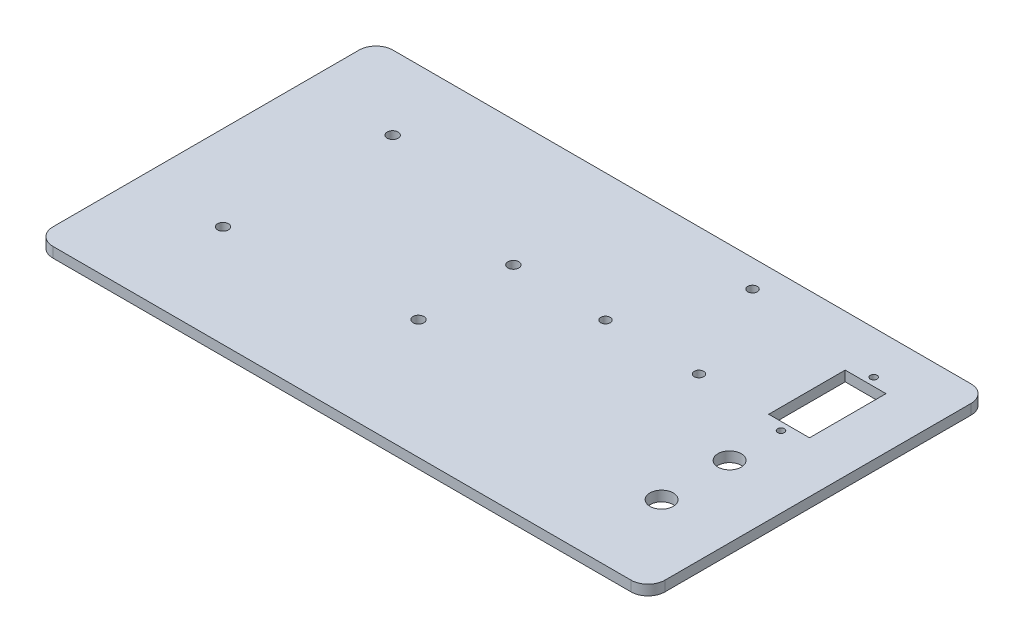
ISO-10303-21;
HEADER;
FILE_DESCRIPTION(('STEP AP214'),'2;1');
FILE_NAME('part.step','',(''),(''),'','','');
FILE_SCHEMA(('AUTOMOTIVE_DESIGN { 1 0 10303 214 1 1 1 1 }'));
ENDSEC;
DATA;
#1=APPLICATION_CONTEXT('core data for automotive mechanical design processes');
#2=APPLICATION_PROTOCOL_DEFINITION('international standard','automotive_design',2000,#1);
#3=PRODUCT_CONTEXT('',#1,'mechanical');
#4=PRODUCT('Part','Part','',(#3));
#5=PRODUCT_RELATED_PRODUCT_CATEGORY('part','',(#4));
#6=PRODUCT_DEFINITION_FORMATION('','',#4);
#7=PRODUCT_DEFINITION_CONTEXT('part definition',#1,'design');
#8=PRODUCT_DEFINITION('design','',#6,#7);
#9=PRODUCT_DEFINITION_SHAPE('','',#8);
#10=(LENGTH_UNIT() NAMED_UNIT(*) SI_UNIT(.MILLI.,.METRE.));
#11=(NAMED_UNIT(*) PLANE_ANGLE_UNIT() SI_UNIT($,.RADIAN.));
#12=(NAMED_UNIT(*) SI_UNIT($,.STERADIAN.) SOLID_ANGLE_UNIT());
#13=UNCERTAINTY_MEASURE_WITH_UNIT(LENGTH_MEASURE(1.E-05),#10,'distance_accuracy_value','');
#14=(GEOMETRIC_REPRESENTATION_CONTEXT(3) GLOBAL_UNCERTAINTY_ASSIGNED_CONTEXT((#13)) GLOBAL_UNIT_ASSIGNED_CONTEXT((#10,
#11,#12)) REPRESENTATION_CONTEXT('',''));
#15=CARTESIAN_POINT('',(0.,0.,0.));
#16=DIRECTION('',(0.,0.,1.));
#17=DIRECTION('',(1.,0.,0.));
#18=AXIS2_PLACEMENT_3D('',#15,#16,#17);
#19=CARTESIAN_POINT('',(90.,3.,-50.));
#20=DIRECTION('',(-1.,0.,0.));
#21=DIRECTION('',(0.,0.,1.));
#22=AXIS2_PLACEMENT_3D('',#19,#20,#21);
#23=PLANE('',#22);
#24=DIRECTION('',(0.,0.,-1.));
#25=VECTOR('',#24,1.);
#26=CARTESIAN_POINT('',(90.,3.,-50.));
#27=LINE('',#26,#25);
#28=CARTESIAN_POINT('',(90.,3.,45.));
#29=VERTEX_POINT('',#28);
#30=CARTESIAN_POINT('',(90.,3.,-45.));
#31=VERTEX_POINT('',#30);
#32=EDGE_CURVE('E186',#29,#31,#27,.T.);
#33=ORIENTED_EDGE('',*,*,#32,.F.);
#34=DIRECTION('',(0.,-1.,0.));
#35=VECTOR('',#34,1.);
#36=CARTESIAN_POINT('',(90.,3.,45.));
#37=LINE('',#36,#35);
#38=CARTESIAN_POINT('',(90.,0.,45.));
#39=VERTEX_POINT('',#38);
#40=EDGE_CURVE('E11',#29,#39,#37,.T.);
#41=ORIENTED_EDGE('',*,*,#40,.T.);
#42=DIRECTION('',(0.,0.,-1.));
#43=VECTOR('',#42,1.);
#44=CARTESIAN_POINT('',(90.,0.,-50.));
#45=LINE('',#44,#43);
#46=CARTESIAN_POINT('',(90.,0.,-45.));
#47=VERTEX_POINT('',#46);
#48=EDGE_CURVE('E204',#39,#47,#45,.T.);
#49=ORIENTED_EDGE('',*,*,#48,.T.);
#50=DIRECTION('',(0.,-1.,0.));
#51=VECTOR('',#50,1.);
#52=CARTESIAN_POINT('',(90.,3.,-45.));
#53=LINE('',#52,#51);
#54=EDGE_CURVE('E49',#47,#31,#53,.F.);
#55=ORIENTED_EDGE('',*,*,#54,.T.);
#56=EDGE_LOOP('',(#33,#41,#49,#55));
#57=FACE_BOUND('',#56,.T.);
#58=ADVANCED_FACE('F40',(#57),#23,.F.);
#59=CARTESIAN_POINT('',(-90.,3.,-50.));
#60=DIRECTION('',(0.,0.,1.));
#61=DIRECTION('',(1.,0.,0.));
#62=AXIS2_PLACEMENT_3D('',#59,#60,#61);
#63=PLANE('',#62);
#64=DIRECTION('',(-1.,0.,0.));
#65=VECTOR('',#64,1.);
#66=CARTESIAN_POINT('',(-90.,0.,-50.));
#67=LINE('',#66,#65);
#68=CARTESIAN_POINT('',(84.9999999999999,0.,-50.));
#69=VERTEX_POINT('',#68);
#70=CARTESIAN_POINT('',(-85.,0.,-50.));
#71=VERTEX_POINT('',#70);
#72=EDGE_CURVE('E208',#69,#71,#67,.T.);
#73=ORIENTED_EDGE('',*,*,#72,.T.);
#74=DIRECTION('',(0.,-1.,0.));
#75=VECTOR('',#74,1.);
#76=CARTESIAN_POINT('',(-85.,3.,-50.));
#77=LINE('',#76,#75);
#78=CARTESIAN_POINT('',(-85.,3.,-50.));
#79=VERTEX_POINT('',#78);
#80=EDGE_CURVE('E256',#71,#79,#77,.F.);
#81=ORIENTED_EDGE('',*,*,#80,.T.);
#82=DIRECTION('',(-1.,0.,0.));
#83=VECTOR('',#82,1.);
#84=CARTESIAN_POINT('',(-90.,3.,-50.));
#85=LINE('',#84,#83);
#86=CARTESIAN_POINT('',(84.9999999999999,3.,-50.));
#87=VERTEX_POINT('',#86);
#88=EDGE_CURVE('E190',#87,#79,#85,.T.);
#89=ORIENTED_EDGE('',*,*,#88,.F.);
#90=DIRECTION('',(0.,-1.,0.));
#91=VECTOR('',#90,1.);
#92=CARTESIAN_POINT('',(85.,3.,-50.));
#93=LINE('',#92,#91);
#94=EDGE_CURVE('E252',#87,#69,#93,.T.);
#95=ORIENTED_EDGE('',*,*,#94,.T.);
#96=EDGE_LOOP('',(#73,#81,#89,#95));
#97=FACE_BOUND('',#96,.T.);
#98=ADVANCED_FACE('F291',(#97),#63,.F.);
#99=CARTESIAN_POINT('',(-90.,3.,-50.));
#100=DIRECTION('',(1.,0.,0.));
#101=DIRECTION('',(0.,0.,-1.));
#102=AXIS2_PLACEMENT_3D('',#99,#100,#101);
#103=PLANE('',#102);
#104=DIRECTION('',(0.,0.,1.));
#105=VECTOR('',#104,1.);
#106=CARTESIAN_POINT('',(-90.,3.,-50.));
#107=LINE('',#106,#105);
#108=CARTESIAN_POINT('',(-90.,3.,-45.));
#109=VERTEX_POINT('',#108);
#110=CARTESIAN_POINT('',(-90.,3.,45.));
#111=VERTEX_POINT('',#110);
#112=EDGE_CURVE('E195',#109,#111,#107,.T.);
#113=ORIENTED_EDGE('',*,*,#112,.F.);
#114=DIRECTION('',(0.,-1.,0.));
#115=VECTOR('',#114,1.);
#116=CARTESIAN_POINT('',(-90.,3.,-45.));
#117=LINE('',#116,#115);
#118=CARTESIAN_POINT('',(-90.,0.,-45.));
#119=VERTEX_POINT('',#118);
#120=EDGE_CURVE('E236',#109,#119,#117,.T.);
#121=ORIENTED_EDGE('',*,*,#120,.T.);
#122=DIRECTION('',(0.,0.,1.));
#123=VECTOR('',#122,1.);
#124=CARTESIAN_POINT('',(-90.,0.,-50.));
#125=LINE('',#124,#123);
#126=CARTESIAN_POINT('',(-90.,0.,45.));
#127=VERTEX_POINT('',#126);
#128=EDGE_CURVE('E213',#119,#127,#125,.T.);
#129=ORIENTED_EDGE('',*,*,#128,.T.);
#130=DIRECTION('',(0.,-1.,0.));
#131=VECTOR('',#130,1.);
#132=CARTESIAN_POINT('',(-90.,3.,45.));
#133=LINE('',#132,#131);
#134=EDGE_CURVE('E203',#127,#111,#133,.F.);
#135=ORIENTED_EDGE('',*,*,#134,.T.);
#136=EDGE_LOOP('',(#113,#121,#129,#135));
#137=FACE_BOUND('',#136,.T.);
#138=ADVANCED_FACE('F302',(#137),#103,.F.);
#139=CARTESIAN_POINT('',(-90.,3.,50.));
#140=DIRECTION('',(0.,0.,-1.));
#141=DIRECTION('',(-1.,0.,0.));
#142=AXIS2_PLACEMENT_3D('',#139,#140,#141);
#143=PLANE('',#142);
#144=DIRECTION('',(1.,0.,0.));
#145=VECTOR('',#144,1.);
#146=CARTESIAN_POINT('',(-90.,3.,50.));
#147=LINE('',#146,#145);
#148=CARTESIAN_POINT('',(-85.,3.,50.));
#149=VERTEX_POINT('',#148);
#150=CARTESIAN_POINT('',(84.9999999999999,3.,50.));
#151=VERTEX_POINT('',#150);
#152=EDGE_CURVE('E199',#149,#151,#147,.T.);
#153=ORIENTED_EDGE('',*,*,#152,.F.);
#154=DIRECTION('',(0.,-1.,0.));
#155=VECTOR('',#154,1.);
#156=CARTESIAN_POINT('',(-85.,3.,50.));
#157=LINE('',#156,#155);
#158=CARTESIAN_POINT('',(-85.,0.,50.));
#159=VERTEX_POINT('',#158);
#160=EDGE_CURVE('E274',#149,#159,#157,.T.);
#161=ORIENTED_EDGE('',*,*,#160,.T.);
#162=DIRECTION('',(1.,0.,0.));
#163=VECTOR('',#162,1.);
#164=CARTESIAN_POINT('',(-90.,0.,50.));
#165=LINE('',#164,#163);
#166=CARTESIAN_POINT('',(84.9999999999999,0.,50.));
#167=VERTEX_POINT('',#166);
#168=EDGE_CURVE('E191',#159,#167,#165,.T.);
#169=ORIENTED_EDGE('',*,*,#168,.T.);
#170=DIRECTION('',(0.,-1.,0.));
#171=VECTOR('',#170,1.);
#172=CARTESIAN_POINT('',(85.,3.,50.));
#173=LINE('',#172,#171);
#174=EDGE_CURVE('E271',#167,#151,#173,.F.);
#175=ORIENTED_EDGE('',*,*,#174,.T.);
#176=EDGE_LOOP('',(#153,#161,#169,#175));
#177=FACE_BOUND('',#176,.T.);
#178=ADVANCED_FACE('F311',(#177),#143,.F.);
#179=CARTESIAN_POINT('',(0.,3.,0.));
#180=DIRECTION('',(0.,1.,0.));
#181=DIRECTION('',(0.,0.,1.));
#182=AXIS2_PLACEMENT_3D('',#179,#180,#181);
#183=PLANE('',#182);
#184=CARTESIAN_POINT('',(28.75,3.,-42.));
#185=DIRECTION('',(0.,1.,0.));
#186=DIRECTION('',(0.,0.,1.));
#187=AXIS2_PLACEMENT_3D('',#184,#185,#186);
#188=CIRCLE('',#187,1.4);
#189=CARTESIAN_POINT('',(28.75,3.,-40.6));
#190=VERTEX_POINT('',#189);
#191=EDGE_CURVE('E556',#190,#190,#188,.T.);
#192=ORIENTED_EDGE('',*,*,#191,.F.);
#193=EDGE_LOOP('',(#192));
#194=FACE_BOUND('',#193,.T.);
#195=CARTESIAN_POINT('',(15.,3.,-12.5));
#196=DIRECTION('',(0.,1.,0.));
#197=DIRECTION('',(0.,0.,1.));
#198=AXIS2_PLACEMENT_3D('',#195,#196,#197);
#199=CIRCLE('',#198,1.4);
#200=CARTESIAN_POINT('',(15.,3.,-11.1));
#201=VERTEX_POINT('',#200);
#202=EDGE_CURVE('E560',#201,#201,#199,.T.);
#203=ORIENTED_EDGE('',*,*,#202,.F.);
#204=EDGE_LOOP('',(#203));
#205=FACE_BOUND('',#204,.T.);
#206=CARTESIAN_POINT('',(42.5,3.,-12.5));
#207=DIRECTION('',(0.,1.,0.));
#208=DIRECTION('',(0.,0.,1.));
#209=AXIS2_PLACEMENT_3D('',#206,#207,#208);
#210=CIRCLE('',#209,1.4);
#211=CARTESIAN_POINT('',(42.5,3.,-11.1));
#212=VERTEX_POINT('',#211);
#213=EDGE_CURVE('E608',#212,#212,#210,.T.);
#214=ORIENTED_EDGE('',*,*,#213,.F.);
#215=EDGE_LOOP('',(#214));
#216=FACE_BOUND('',#215,.T.);
#217=CARTESIAN_POINT('',(69.,3.,25.));
#218=DIRECTION('',(0.,1.,0.));
#219=DIRECTION('',(0.,0.,1.));
#220=AXIS2_PLACEMENT_3D('',#217,#218,#219);
#221=CIRCLE('',#220,3.43);
#222=CARTESIAN_POINT('',(69.,3.,28.43));
#223=VERTEX_POINT('',#222);
#224=EDGE_CURVE('E600',#223,#223,#221,.T.);
#225=ORIENTED_EDGE('',*,*,#224,.F.);
#226=EDGE_LOOP('',(#225));
#227=FACE_BOUND('',#226,.T.);
#228=CARTESIAN_POINT('',(69.,3.,4.99999999999999));
#229=DIRECTION('',(0.,1.,0.));
#230=DIRECTION('',(0.,0.,1.));
#231=AXIS2_PLACEMENT_3D('',#228,#229,#230);
#232=CIRCLE('',#231,3.43);
#233=CARTESIAN_POINT('',(69.,3.,8.42999999999999));
#234=VERTEX_POINT('',#233);
#235=EDGE_CURVE('E592',#234,#234,#232,.T.);
#236=ORIENTED_EDGE('',*,*,#235,.F.);
#237=EDGE_LOOP('',(#236));
#238=FACE_BOUND('',#237,.T.);
#239=CARTESIAN_POINT('',(69.,3.,-37.38));
#240=DIRECTION('',(0.,1.,0.));
#241=DIRECTION('',(0.,0.,1.));
#242=AXIS2_PLACEMENT_3D('',#239,#240,#241);
#243=CIRCLE('',#242,0.999999999999998);
#244=CARTESIAN_POINT('',(69.,3.,-36.38));
#245=VERTEX_POINT('',#244);
#246=EDGE_CURVE('E584',#245,#245,#243,.T.);
#247=ORIENTED_EDGE('',*,*,#246,.F.);
#248=EDGE_LOOP('',(#247));
#249=FACE_BOUND('',#248,.T.);
#250=CARTESIAN_POINT('',(69.,3.,-10.12));
#251=DIRECTION('',(0.,1.,0.));
#252=DIRECTION('',(0.,0.,1.));
#253=AXIS2_PLACEMENT_3D('',#250,#251,#252);
#254=CIRCLE('',#253,0.999999999999998);
#255=CARTESIAN_POINT('',(69.,3.,-9.12000000000002));
#256=VERTEX_POINT('',#255);
#257=EDGE_CURVE('E576',#256,#256,#254,.T.);
#258=ORIENTED_EDGE('',*,*,#257,.F.);
#259=EDGE_LOOP('',(#258));
#260=FACE_BOUND('',#259,.T.);
#261=DIRECTION('',(0.,0.,-1.));
#262=VECTOR('',#261,1.);
#263=CARTESIAN_POINT('',(75.,3.,-35.));
#264=LINE('',#263,#262);
#265=CARTESIAN_POINT('',(75.,3.,-12.5));
#266=VERTEX_POINT('',#265);
#267=CARTESIAN_POINT('',(75.,3.,-35.));
#268=VERTEX_POINT('',#267);
#269=EDGE_CURVE('E56',#266,#268,#264,.T.);
#270=ORIENTED_EDGE('',*,*,#269,.F.);
#271=DIRECTION('',(1.,0.,0.));
#272=VECTOR('',#271,1.);
#273=CARTESIAN_POINT('',(63.,3.,-12.5));
#274=LINE('',#273,#272);
#275=CARTESIAN_POINT('',(63.,3.,-12.5));
#276=VERTEX_POINT('',#275);
#277=EDGE_CURVE('E151',#276,#266,#274,.T.);
#278=ORIENTED_EDGE('',*,*,#277,.F.);
#279=DIRECTION('',(0.,0.,1.));
#280=VECTOR('',#279,1.);
#281=CARTESIAN_POINT('',(63.,3.,-35.));
#282=LINE('',#281,#280);
#283=CARTESIAN_POINT('',(63.,3.,-35.));
#284=VERTEX_POINT('',#283);
#285=EDGE_CURVE('E133',#284,#276,#282,.T.);
#286=ORIENTED_EDGE('',*,*,#285,.F.);
#287=DIRECTION('',(-1.,0.,0.));
#288=VECTOR('',#287,1.);
#289=CARTESIAN_POINT('',(63.,3.,-35.));
#290=LINE('',#289,#288);
#291=EDGE_CURVE('E143',#268,#284,#290,.T.);
#292=ORIENTED_EDGE('',*,*,#291,.F.);
#293=EDGE_LOOP('',(#270,#278,#286,#292));
#294=FACE_BOUND('',#293,.T.);
#295=CARTESIAN_POINT('',(-65.,3.,20.));
#296=DIRECTION('',(0.,1.,0.));
#297=DIRECTION('',(0.,0.,1.));
#298=AXIS2_PLACEMENT_3D('',#295,#296,#297);
#299=CIRCLE('',#298,1.6);
#300=CARTESIAN_POINT('',(-65.,3.,21.6));
#301=VERTEX_POINT('',#300);
#302=EDGE_CURVE('E170',#301,#301,#299,.T.);
#303=ORIENTED_EDGE('',*,*,#302,.F.);
#304=EDGE_LOOP('',(#303));
#305=FACE_BOUND('',#304,.T.);
#306=CARTESIAN_POINT('',(-63.4,3.,-28.3));
#307=DIRECTION('',(0.,1.,0.));
#308=DIRECTION('',(0.,0.,1.));
#309=AXIS2_PLACEMENT_3D('',#306,#307,#308);
#310=CIRCLE('',#309,1.6);
#311=CARTESIAN_POINT('',(-63.4,3.,-26.7));
#312=VERTEX_POINT('',#311);
#313=EDGE_CURVE('E175',#312,#312,#310,.T.);
#314=ORIENTED_EDGE('',*,*,#313,.F.);
#315=EDGE_LOOP('',(#314));
#316=FACE_BOUND('',#315,.T.);
#317=CARTESIAN_POINT('',(-12.6,3.,-13.));
#318=DIRECTION('',(0.,1.,0.));
#319=DIRECTION('',(0.,0.,1.));
#320=AXIS2_PLACEMENT_3D('',#317,#318,#319);
#321=CIRCLE('',#320,1.6);
#322=CARTESIAN_POINT('',(-12.6,3.,-11.4));
#323=VERTEX_POINT('',#322);
#324=EDGE_CURVE('E179',#323,#323,#321,.T.);
#325=ORIENTED_EDGE('',*,*,#324,.F.);
#326=EDGE_LOOP('',(#325));
#327=FACE_BOUND('',#326,.T.);
#328=CARTESIAN_POINT('',(-12.6,3.,14.9));
#329=DIRECTION('',(0.,1.,0.));
#330=DIRECTION('',(0.,0.,1.));
#331=AXIS2_PLACEMENT_3D('',#328,#329,#330);
#332=CIRCLE('',#331,1.6);
#333=CARTESIAN_POINT('',(-12.6,3.,16.5));
#334=VERTEX_POINT('',#333);
#335=EDGE_CURVE('E168',#334,#334,#332,.T.);
#336=ORIENTED_EDGE('',*,*,#335,.F.);
#337=EDGE_LOOP('',(#336));
#338=FACE_BOUND('',#337,.T.);
#339=ORIENTED_EDGE('',*,*,#88,.T.);
#340=CARTESIAN_POINT('',(-85.,3.,-45.));
#341=DIRECTION('',(0.,1.,0.));
#342=DIRECTION('',(0.,0.,1.));
#343=AXIS2_PLACEMENT_3D('',#340,#341,#342);
#344=CIRCLE('',#343,5.);
#345=EDGE_CURVE('E268',#79,#109,#344,.T.);
#346=ORIENTED_EDGE('',*,*,#345,.T.);
#347=ORIENTED_EDGE('',*,*,#112,.T.);
#348=CARTESIAN_POINT('',(-85.,3.,45.));
#349=DIRECTION('',(0.,1.,0.));
#350=DIRECTION('',(0.,0.,1.));
#351=AXIS2_PLACEMENT_3D('',#348,#349,#350);
#352=CIRCLE('',#351,5.);
#353=EDGE_CURVE('E265',#111,#149,#352,.T.);
#354=ORIENTED_EDGE('',*,*,#353,.T.);
#355=ORIENTED_EDGE('',*,*,#152,.T.);
#356=CARTESIAN_POINT('',(85.,3.,45.));
#357=DIRECTION('',(0.,1.,0.));
#358=DIRECTION('',(0.,0.,1.));
#359=AXIS2_PLACEMENT_3D('',#356,#357,#358);
#360=CIRCLE('',#359,5.);
#361=EDGE_CURVE('E262',#151,#29,#360,.T.);
#362=ORIENTED_EDGE('',*,*,#361,.T.);
#363=ORIENTED_EDGE('',*,*,#32,.T.);
#364=CARTESIAN_POINT('',(85.,3.,-45.));
#365=DIRECTION('',(0.,1.,0.));
#366=DIRECTION('',(0.,0.,1.));
#367=AXIS2_PLACEMENT_3D('',#364,#365,#366);
#368=CIRCLE('',#367,5.);
#369=EDGE_CURVE('E259',#31,#87,#368,.T.);
#370=ORIENTED_EDGE('',*,*,#369,.T.);
#371=EDGE_LOOP('',(#339,#346,#347,#354,#355,#362,#363,#370));
#372=FACE_BOUND('',#371,.T.);
#373=ADVANCED_FACE('F148',(#194,#205,#216,#227,#238,#249,#260,#294,#305,#316,#327,#338,#372),
#183,.T.);
#374=CARTESIAN_POINT('',(0.,0.,0.));
#375=DIRECTION('',(0.,1.,0.));
#376=DIRECTION('',(0.,0.,1.));
#377=AXIS2_PLACEMENT_3D('',#374,#375,#376);
#378=PLANE('',#377);
#379=CARTESIAN_POINT('',(28.75,0.,-42.));
#380=DIRECTION('',(0.,1.,0.));
#381=DIRECTION('',(0.,0.,1.));
#382=AXIS2_PLACEMENT_3D('',#379,#380,#381);
#383=CIRCLE('',#382,1.4);
#384=CARTESIAN_POINT('',(28.75,0.,-40.6));
#385=VERTEX_POINT('',#384);
#386=EDGE_CURVE('E553',#385,#385,#383,.F.);
#387=ORIENTED_EDGE('',*,*,#386,.F.);
#388=EDGE_LOOP('',(#387));
#389=FACE_BOUND('',#388,.T.);
#390=CARTESIAN_POINT('',(15.,0.,-12.5));
#391=DIRECTION('',(0.,1.,0.));
#392=DIRECTION('',(0.,0.,1.));
#393=AXIS2_PLACEMENT_3D('',#390,#391,#392);
#394=CIRCLE('',#393,1.4);
#395=CARTESIAN_POINT('',(15.,0.,-11.1));
#396=VERTEX_POINT('',#395);
#397=EDGE_CURVE('E563',#396,#396,#394,.F.);
#398=ORIENTED_EDGE('',*,*,#397,.F.);
#399=EDGE_LOOP('',(#398));
#400=FACE_BOUND('',#399,.T.);
#401=CARTESIAN_POINT('',(42.5,0.,-12.5));
#402=DIRECTION('',(0.,1.,0.));
#403=DIRECTION('',(0.,0.,1.));
#404=AXIS2_PLACEMENT_3D('',#401,#402,#403);
#405=CIRCLE('',#404,1.4);
#406=CARTESIAN_POINT('',(42.5,0.,-11.1));
#407=VERTEX_POINT('',#406);
#408=EDGE_CURVE('E604',#407,#407,#405,.F.);
#409=ORIENTED_EDGE('',*,*,#408,.F.);
#410=EDGE_LOOP('',(#409));
#411=FACE_BOUND('',#410,.T.);
#412=CARTESIAN_POINT('',(69.,0.,25.));
#413=DIRECTION('',(0.,1.,0.));
#414=DIRECTION('',(0.,0.,1.));
#415=AXIS2_PLACEMENT_3D('',#412,#413,#414);
#416=CIRCLE('',#415,3.43);
#417=CARTESIAN_POINT('',(69.,0.,28.43));
#418=VERTEX_POINT('',#417);
#419=EDGE_CURVE('E596',#418,#418,#416,.F.);
#420=ORIENTED_EDGE('',*,*,#419,.F.);
#421=EDGE_LOOP('',(#420));
#422=FACE_BOUND('',#421,.T.);
#423=CARTESIAN_POINT('',(69.,0.,4.99999999999999));
#424=DIRECTION('',(0.,1.,0.));
#425=DIRECTION('',(0.,0.,1.));
#426=AXIS2_PLACEMENT_3D('',#423,#424,#425);
#427=CIRCLE('',#426,3.43);
#428=CARTESIAN_POINT('',(69.,0.,8.42999999999999));
#429=VERTEX_POINT('',#428);
#430=EDGE_CURVE('E588',#429,#429,#427,.F.);
#431=ORIENTED_EDGE('',*,*,#430,.F.);
#432=EDGE_LOOP('',(#431));
#433=FACE_BOUND('',#432,.T.);
#434=CARTESIAN_POINT('',(69.,0.,-37.38));
#435=DIRECTION('',(0.,1.,0.));
#436=DIRECTION('',(0.,0.,1.));
#437=AXIS2_PLACEMENT_3D('',#434,#435,#436);
#438=CIRCLE('',#437,0.999999999999998);
#439=CARTESIAN_POINT('',(69.,0.,-36.38));
#440=VERTEX_POINT('',#439);
#441=EDGE_CURVE('E581',#440,#440,#438,.F.);
#442=ORIENTED_EDGE('',*,*,#441,.F.);
#443=EDGE_LOOP('',(#442));
#444=FACE_BOUND('',#443,.T.);
#445=CARTESIAN_POINT('',(69.,0.,-10.12));
#446=DIRECTION('',(0.,1.,0.));
#447=DIRECTION('',(0.,0.,1.));
#448=AXIS2_PLACEMENT_3D('',#445,#446,#447);
#449=CIRCLE('',#448,0.999999999999998);
#450=CARTESIAN_POINT('',(69.,0.,-9.12000000000002));
#451=VERTEX_POINT('',#450);
#452=EDGE_CURVE('E573',#451,#451,#449,.F.);
#453=ORIENTED_EDGE('',*,*,#452,.F.);
#454=EDGE_LOOP('',(#453));
#455=FACE_BOUND('',#454,.T.);
#456=DIRECTION('',(-1.,0.,0.));
#457=VECTOR('',#456,1.);
#458=CARTESIAN_POINT('',(63.,0.,-12.5));
#459=LINE('',#458,#457);
#460=CARTESIAN_POINT('',(75.,0.,-12.5));
#461=VERTEX_POINT('',#460);
#462=CARTESIAN_POINT('',(63.,0.,-12.5));
#463=VERTEX_POINT('',#462);
#464=EDGE_CURVE('E568',#461,#463,#459,.T.);
#465=ORIENTED_EDGE('',*,*,#464,.F.);
#466=DIRECTION('',(0.,0.,1.));
#467=VECTOR('',#466,1.);
#468=CARTESIAN_POINT('',(75.,0.,-35.));
#469=LINE('',#468,#467);
#470=CARTESIAN_POINT('',(75.,0.,-35.));
#471=VERTEX_POINT('',#470);
#472=EDGE_CURVE('E169',#471,#461,#469,.T.);
#473=ORIENTED_EDGE('',*,*,#472,.F.);
#474=DIRECTION('',(1.,0.,0.));
#475=VECTOR('',#474,1.);
#476=CARTESIAN_POINT('',(63.,0.,-35.));
#477=LINE('',#476,#475);
#478=CARTESIAN_POINT('',(63.,0.,-35.));
#479=VERTEX_POINT('',#478);
#480=EDGE_CURVE('E165',#479,#471,#477,.T.);
#481=ORIENTED_EDGE('',*,*,#480,.F.);
#482=DIRECTION('',(0.,0.,-1.));
#483=VECTOR('',#482,1.);
#484=CARTESIAN_POINT('',(63.,0.,-35.));
#485=LINE('',#484,#483);
#486=EDGE_CURVE('E136',#463,#479,#485,.T.);
#487=ORIENTED_EDGE('',*,*,#486,.F.);
#488=EDGE_LOOP('',(#465,#473,#481,#487));
#489=FACE_BOUND('',#488,.T.);
#490=CARTESIAN_POINT('',(-65.,0.,20.));
#491=DIRECTION('',(0.,1.,0.));
#492=DIRECTION('',(0.,0.,1.));
#493=AXIS2_PLACEMENT_3D('',#490,#491,#492);
#494=CIRCLE('',#493,1.6);
#495=CARTESIAN_POINT('',(-65.,0.,21.6));
#496=VERTEX_POINT('',#495);
#497=EDGE_CURVE('E209',#496,#496,#494,.T.);
#498=ORIENTED_EDGE('',*,*,#497,.T.);
#499=EDGE_LOOP('',(#498));
#500=FACE_BOUND('',#499,.T.);
#501=CARTESIAN_POINT('',(-63.4,0.,-28.3));
#502=DIRECTION('',(0.,1.,0.));
#503=DIRECTION('',(0.,0.,1.));
#504=AXIS2_PLACEMENT_3D('',#501,#502,#503);
#505=CIRCLE('',#504,1.6);
#506=CARTESIAN_POINT('',(-63.4,0.,-26.7));
#507=VERTEX_POINT('',#506);
#508=EDGE_CURVE('E227',#507,#507,#505,.T.);
#509=ORIENTED_EDGE('',*,*,#508,.T.);
#510=EDGE_LOOP('',(#509));
#511=FACE_BOUND('',#510,.T.);
#512=CARTESIAN_POINT('',(-12.6,0.,-13.));
#513=DIRECTION('',(0.,1.,0.));
#514=DIRECTION('',(0.,0.,1.));
#515=AXIS2_PLACEMENT_3D('',#512,#513,#514);
#516=CIRCLE('',#515,1.6);
#517=CARTESIAN_POINT('',(-12.6,0.,-11.4));
#518=VERTEX_POINT('',#517);
#519=EDGE_CURVE('E223',#518,#518,#516,.T.);
#520=ORIENTED_EDGE('',*,*,#519,.T.);
#521=EDGE_LOOP('',(#520));
#522=FACE_BOUND('',#521,.T.);
#523=CARTESIAN_POINT('',(-12.6,0.,14.9));
#524=DIRECTION('',(0.,1.,0.));
#525=DIRECTION('',(0.,0.,1.));
#526=AXIS2_PLACEMENT_3D('',#523,#524,#525);
#527=CIRCLE('',#526,1.6);
#528=CARTESIAN_POINT('',(-12.6,0.,16.5));
#529=VERTEX_POINT('',#528);
#530=EDGE_CURVE('E174',#529,#529,#527,.T.);
#531=ORIENTED_EDGE('',*,*,#530,.T.);
#532=EDGE_LOOP('',(#531));
#533=FACE_BOUND('',#532,.T.);
#534=ORIENTED_EDGE('',*,*,#128,.F.);
#535=CARTESIAN_POINT('',(-85.,0.,-45.));
#536=DIRECTION('',(0.,1.,0.));
#537=DIRECTION('',(0.,0.,1.));
#538=AXIS2_PLACEMENT_3D('',#535,#536,#537);
#539=CIRCLE('',#538,5.);
#540=EDGE_CURVE('E249',#119,#71,#539,.F.);
#541=ORIENTED_EDGE('',*,*,#540,.T.);
#542=ORIENTED_EDGE('',*,*,#72,.F.);
#543=CARTESIAN_POINT('',(85.,0.,-45.));
#544=DIRECTION('',(0.,1.,0.));
#545=DIRECTION('',(0.,0.,1.));
#546=AXIS2_PLACEMENT_3D('',#543,#544,#545);
#547=CIRCLE('',#546,5.);
#548=EDGE_CURVE('E240',#69,#47,#547,.F.);
#549=ORIENTED_EDGE('',*,*,#548,.T.);
#550=ORIENTED_EDGE('',*,*,#48,.F.);
#551=CARTESIAN_POINT('',(85.,0.,45.));
#552=DIRECTION('',(0.,1.,0.));
#553=DIRECTION('',(0.,0.,1.));
#554=AXIS2_PLACEMENT_3D('',#551,#552,#553);
#555=CIRCLE('',#554,5.);
#556=EDGE_CURVE('E243',#39,#167,#555,.F.);
#557=ORIENTED_EDGE('',*,*,#556,.T.);
#558=ORIENTED_EDGE('',*,*,#168,.F.);
#559=CARTESIAN_POINT('',(-85.,0.,45.));
#560=DIRECTION('',(0.,1.,0.));
#561=DIRECTION('',(0.,0.,1.));
#562=AXIS2_PLACEMENT_3D('',#559,#560,#561);
#563=CIRCLE('',#562,5.);
#564=EDGE_CURVE('E246',#159,#127,#563,.F.);
#565=ORIENTED_EDGE('',*,*,#564,.T.);
#566=EDGE_LOOP('',(#534,#541,#542,#549,#550,#557,#558,#565));
#567=FACE_BOUND('',#566,.T.);
#568=ADVANCED_FACE('F295',(#389,#400,#411,#422,#433,#444,#455,#489,#500,#511,#522,#533,#567),
#378,.F.);
#569=CARTESIAN_POINT('',(-12.6,-7.,14.9));
#570=DIRECTION('',(0.,1.,0.));
#571=DIRECTION('',(0.,0.,1.));
#572=AXIS2_PLACEMENT_3D('',#569,#570,#571);
#573=CYLINDRICAL_SURFACE('',#572,1.6);
#574=ORIENTED_EDGE('',*,*,#335,.T.);
#575=EDGE_LOOP('',(#574));
#576=FACE_BOUND('',#575,.T.);
#577=ORIENTED_EDGE('',*,*,#530,.F.);
#578=EDGE_LOOP('',(#577));
#579=FACE_BOUND('',#578,.T.);
#580=ADVANCED_FACE('F350',(#576,#579),#573,.F.);
#581=CARTESIAN_POINT('',(-12.6,-7.,-13.));
#582=DIRECTION('',(0.,1.,0.));
#583=DIRECTION('',(0.,0.,1.));
#584=AXIS2_PLACEMENT_3D('',#581,#582,#583);
#585=CYLINDRICAL_SURFACE('',#584,1.6);
#586=ORIENTED_EDGE('',*,*,#324,.T.);
#587=EDGE_LOOP('',(#586));
#588=FACE_BOUND('',#587,.T.);
#589=ORIENTED_EDGE('',*,*,#519,.F.);
#590=EDGE_LOOP('',(#589));
#591=FACE_BOUND('',#590,.T.);
#592=ADVANCED_FACE('F341',(#588,#591),#585,.F.);
#593=CARTESIAN_POINT('',(-63.4,-7.,-28.3));
#594=DIRECTION('',(0.,1.,0.));
#595=DIRECTION('',(0.,0.,1.));
#596=AXIS2_PLACEMENT_3D('',#593,#594,#595);
#597=CYLINDRICAL_SURFACE('',#596,1.6);
#598=ORIENTED_EDGE('',*,*,#313,.T.);
#599=EDGE_LOOP('',(#598));
#600=FACE_BOUND('',#599,.T.);
#601=ORIENTED_EDGE('',*,*,#508,.F.);
#602=EDGE_LOOP('',(#601));
#603=FACE_BOUND('',#602,.T.);
#604=ADVANCED_FACE('F335',(#600,#603),#597,.F.);
#605=CARTESIAN_POINT('',(-65.,-7.,20.));
#606=DIRECTION('',(0.,1.,0.));
#607=DIRECTION('',(0.,0.,1.));
#608=AXIS2_PLACEMENT_3D('',#605,#606,#607);
#609=CYLINDRICAL_SURFACE('',#608,1.6);
#610=ORIENTED_EDGE('',*,*,#302,.T.);
#611=EDGE_LOOP('',(#610));
#612=FACE_BOUND('',#611,.T.);
#613=ORIENTED_EDGE('',*,*,#497,.F.);
#614=EDGE_LOOP('',(#613));
#615=FACE_BOUND('',#614,.T.);
#616=ADVANCED_FACE('F331',(#612,#615),#609,.F.);
#617=CARTESIAN_POINT('',(-85.,3.,-45.));
#618=DIRECTION('',(0.,-1.,0.));
#619=DIRECTION('',(0.,0.,-1.));
#620=AXIS2_PLACEMENT_3D('',#617,#618,#619);
#621=CYLINDRICAL_SURFACE('',#620,5.);
#622=ORIENTED_EDGE('',*,*,#345,.F.);
#623=ORIENTED_EDGE('',*,*,#80,.F.);
#624=ORIENTED_EDGE('',*,*,#540,.F.);
#625=ORIENTED_EDGE('',*,*,#120,.F.);
#626=EDGE_LOOP('',(#622,#623,#624,#625));
#627=FACE_BOUND('',#626,.T.);
#628=ADVANCED_FACE('F299',(#627),#621,.T.);
#629=CARTESIAN_POINT('',(-85.,3.,45.));
#630=DIRECTION('',(0.,-1.,0.));
#631=DIRECTION('',(0.,0.,-1.));
#632=AXIS2_PLACEMENT_3D('',#629,#630,#631);
#633=CYLINDRICAL_SURFACE('',#632,5.);
#634=ORIENTED_EDGE('',*,*,#353,.F.);
#635=ORIENTED_EDGE('',*,*,#134,.F.);
#636=ORIENTED_EDGE('',*,*,#564,.F.);
#637=ORIENTED_EDGE('',*,*,#160,.F.);
#638=EDGE_LOOP('',(#634,#635,#636,#637));
#639=FACE_BOUND('',#638,.T.);
#640=ADVANCED_FACE('F308',(#639),#633,.T.);
#641=CARTESIAN_POINT('',(85.,3.,45.));
#642=DIRECTION('',(0.,-1.,0.));
#643=DIRECTION('',(0.,0.,-1.));
#644=AXIS2_PLACEMENT_3D('',#641,#642,#643);
#645=CYLINDRICAL_SURFACE('',#644,5.);
#646=ORIENTED_EDGE('',*,*,#361,.F.);
#647=ORIENTED_EDGE('',*,*,#174,.F.);
#648=ORIENTED_EDGE('',*,*,#556,.F.);
#649=ORIENTED_EDGE('',*,*,#40,.F.);
#650=EDGE_LOOP('',(#646,#647,#648,#649));
#651=FACE_BOUND('',#650,.T.);
#652=ADVANCED_FACE('F314',(#651),#645,.T.);
#653=CARTESIAN_POINT('',(85.,3.,-45.));
#654=DIRECTION('',(0.,-1.,0.));
#655=DIRECTION('',(0.,0.,-1.));
#656=AXIS2_PLACEMENT_3D('',#653,#654,#655);
#657=CYLINDRICAL_SURFACE('',#656,5.);
#658=ORIENTED_EDGE('',*,*,#369,.F.);
#659=ORIENTED_EDGE('',*,*,#54,.F.);
#660=ORIENTED_EDGE('',*,*,#548,.F.);
#661=ORIENTED_EDGE('',*,*,#94,.F.);
#662=EDGE_LOOP('',(#658,#659,#660,#661));
#663=FACE_BOUND('',#662,.T.);
#664=ADVANCED_FACE('F42',(#663),#657,.T.);
#665=CARTESIAN_POINT('',(75.,-25.5,-35.));
#666=DIRECTION('',(1.,0.,0.));
#667=DIRECTION('',(0.,0.,-1.));
#668=AXIS2_PLACEMENT_3D('',#665,#666,#667);
#669=PLANE('',#668);
#670=ORIENTED_EDGE('',*,*,#472,.T.);
#671=DIRECTION('',(0.,1.,0.));
#672=VECTOR('',#671,1.);
#673=CARTESIAN_POINT('',(75.,-25.5,-12.5));
#674=LINE('',#673,#672);
#675=EDGE_CURVE('E158',#461,#266,#674,.T.);
#676=ORIENTED_EDGE('',*,*,#675,.T.);
#677=ORIENTED_EDGE('',*,*,#269,.T.);
#678=DIRECTION('',(0.,1.,0.));
#679=VECTOR('',#678,1.);
#680=CARTESIAN_POINT('',(75.,-25.5,-35.));
#681=LINE('',#680,#679);
#682=EDGE_CURVE('E140',#471,#268,#681,.T.);
#683=ORIENTED_EDGE('',*,*,#682,.F.);
#684=EDGE_LOOP('',(#670,#676,#677,#683));
#685=FACE_BOUND('',#684,.T.);
#686=ADVANCED_FACE('F320',(#685),#669,.F.);
#687=CARTESIAN_POINT('',(63.,-25.5,-12.5));
#688=DIRECTION('',(0.,0.,1.));
#689=DIRECTION('',(1.,0.,0.));
#690=AXIS2_PLACEMENT_3D('',#687,#688,#689);
#691=PLANE('',#690);
#692=ORIENTED_EDGE('',*,*,#464,.T.);
#693=DIRECTION('',(0.,1.,0.));
#694=VECTOR('',#693,1.);
#695=CARTESIAN_POINT('',(63.,-25.5,-12.5));
#696=LINE('',#695,#694);
#697=EDGE_CURVE('E139',#463,#276,#696,.T.);
#698=ORIENTED_EDGE('',*,*,#697,.T.);
#699=ORIENTED_EDGE('',*,*,#277,.T.);
#700=ORIENTED_EDGE('',*,*,#675,.F.);
#701=EDGE_LOOP('',(#692,#698,#699,#700));
#702=FACE_BOUND('',#701,.T.);
#703=ADVANCED_FACE('F433',(#702),#691,.F.);
#704=CARTESIAN_POINT('',(63.,-25.5,-35.));
#705=DIRECTION('',(-1.,0.,0.));
#706=DIRECTION('',(0.,0.,1.));
#707=AXIS2_PLACEMENT_3D('',#704,#705,#706);
#708=PLANE('',#707);
#709=ORIENTED_EDGE('',*,*,#486,.T.);
#710=DIRECTION('',(0.,1.,0.));
#711=VECTOR('',#710,1.);
#712=CARTESIAN_POINT('',(63.,-25.5,-35.));
#713=LINE('',#712,#711);
#714=EDGE_CURVE('E64',#479,#284,#713,.T.);
#715=ORIENTED_EDGE('',*,*,#714,.T.);
#716=ORIENTED_EDGE('',*,*,#285,.T.);
#717=ORIENTED_EDGE('',*,*,#697,.F.);
#718=EDGE_LOOP('',(#709,#715,#716,#717));
#719=FACE_BOUND('',#718,.T.);
#720=ADVANCED_FACE('F130',(#719),#708,.F.);
#721=CARTESIAN_POINT('',(63.,-25.5,-35.));
#722=DIRECTION('',(0.,0.,-1.));
#723=DIRECTION('',(-1.,0.,0.));
#724=AXIS2_PLACEMENT_3D('',#721,#722,#723);
#725=PLANE('',#724);
#726=ORIENTED_EDGE('',*,*,#480,.T.);
#727=ORIENTED_EDGE('',*,*,#682,.T.);
#728=ORIENTED_EDGE('',*,*,#291,.T.);
#729=ORIENTED_EDGE('',*,*,#714,.F.);
#730=EDGE_LOOP('',(#726,#727,#728,#729));
#731=FACE_BOUND('',#730,.T.);
#732=ADVANCED_FACE('F144',(#731),#725,.F.);
#733=CARTESIAN_POINT('',(69.,-25.5,-10.12));
#734=DIRECTION('',(0.,1.,0.));
#735=DIRECTION('',(0.,0.,1.));
#736=AXIS2_PLACEMENT_3D('',#733,#734,#735);
#737=CYLINDRICAL_SURFACE('',#736,0.999999999999998);
#738=ORIENTED_EDGE('',*,*,#452,.T.);
#739=EDGE_LOOP('',(#738));
#740=FACE_BOUND('',#739,.T.);
#741=ORIENTED_EDGE('',*,*,#257,.T.);
#742=EDGE_LOOP('',(#741));
#743=FACE_BOUND('',#742,.T.);
#744=ADVANCED_FACE('F452',(#740,#743),#737,.F.);
#745=CARTESIAN_POINT('',(69.,-25.5,-37.38));
#746=DIRECTION('',(0.,1.,0.));
#747=DIRECTION('',(0.,0.,1.));
#748=AXIS2_PLACEMENT_3D('',#745,#746,#747);
#749=CYLINDRICAL_SURFACE('',#748,0.999999999999998);
#750=ORIENTED_EDGE('',*,*,#441,.T.);
#751=EDGE_LOOP('',(#750));
#752=FACE_BOUND('',#751,.T.);
#753=ORIENTED_EDGE('',*,*,#246,.T.);
#754=EDGE_LOOP('',(#753));
#755=FACE_BOUND('',#754,.T.);
#756=ADVANCED_FACE('F458',(#752,#755),#749,.F.);
#757=CARTESIAN_POINT('',(69.,-25.5,4.99999999999999));
#758=DIRECTION('',(0.,1.,0.));
#759=DIRECTION('',(0.,0.,1.));
#760=AXIS2_PLACEMENT_3D('',#757,#758,#759);
#761=CYLINDRICAL_SURFACE('',#760,3.43);
#762=ORIENTED_EDGE('',*,*,#430,.T.);
#763=EDGE_LOOP('',(#762));
#764=FACE_BOUND('',#763,.T.);
#765=ORIENTED_EDGE('',*,*,#235,.T.);
#766=EDGE_LOOP('',(#765));
#767=FACE_BOUND('',#766,.T.);
#768=ADVANCED_FACE('F466',(#764,#767),#761,.F.);
#769=CARTESIAN_POINT('',(69.,-25.5,25.));
#770=DIRECTION('',(0.,1.,0.));
#771=DIRECTION('',(0.,0.,1.));
#772=AXIS2_PLACEMENT_3D('',#769,#770,#771);
#773=CYLINDRICAL_SURFACE('',#772,3.43);
#774=ORIENTED_EDGE('',*,*,#419,.T.);
#775=EDGE_LOOP('',(#774));
#776=FACE_BOUND('',#775,.T.);
#777=ORIENTED_EDGE('',*,*,#224,.T.);
#778=EDGE_LOOP('',(#777));
#779=FACE_BOUND('',#778,.T.);
#780=ADVANCED_FACE('F474',(#776,#779),#773,.F.);
#781=CARTESIAN_POINT('',(42.5,-25.5,-12.5));
#782=DIRECTION('',(0.,1.,0.));
#783=DIRECTION('',(0.,0.,1.));
#784=AXIS2_PLACEMENT_3D('',#781,#782,#783);
#785=CYLINDRICAL_SURFACE('',#784,1.4);
#786=ORIENTED_EDGE('',*,*,#408,.T.);
#787=EDGE_LOOP('',(#786));
#788=FACE_BOUND('',#787,.T.);
#789=ORIENTED_EDGE('',*,*,#213,.T.);
#790=EDGE_LOOP('',(#789));
#791=FACE_BOUND('',#790,.T.);
#792=ADVANCED_FACE('F482',(#788,#791),#785,.F.);
#793=CARTESIAN_POINT('',(15.,-25.5,-12.5));
#794=DIRECTION('',(0.,1.,0.));
#795=DIRECTION('',(0.,0.,1.));
#796=AXIS2_PLACEMENT_3D('',#793,#794,#795);
#797=CYLINDRICAL_SURFACE('',#796,1.4);
#798=ORIENTED_EDGE('',*,*,#397,.T.);
#799=EDGE_LOOP('',(#798));
#800=FACE_BOUND('',#799,.T.);
#801=ORIENTED_EDGE('',*,*,#202,.T.);
#802=EDGE_LOOP('',(#801));
#803=FACE_BOUND('',#802,.T.);
#804=ADVANCED_FACE('F490',(#800,#803),#797,.F.);
#805=CARTESIAN_POINT('',(28.75,-25.5,-42.));
#806=DIRECTION('',(0.,1.,0.));
#807=DIRECTION('',(0.,0.,1.));
#808=AXIS2_PLACEMENT_3D('',#805,#806,#807);
#809=CYLINDRICAL_SURFACE('',#808,1.4);
#810=ORIENTED_EDGE('',*,*,#386,.T.);
#811=EDGE_LOOP('',(#810));
#812=FACE_BOUND('',#811,.T.);
#813=ORIENTED_EDGE('',*,*,#191,.T.);
#814=EDGE_LOOP('',(#813));
#815=FACE_BOUND('',#814,.T.);
#816=ADVANCED_FACE('F498',(#812,#815),#809,.F.);
#817=CLOSED_SHELL('',(#58,#98,#138,#178,#373,#568,#580,#592,#604,#616,#628,#640,#652,#664,#686,
#703,#720,#732,#744,#756,#768,#780,#792,#804,#816));
#818=MANIFOLD_SOLID_BREP('B2',#817);
#819=ADVANCED_BREP_SHAPE_REPRESENTATION('',(#18,#818),#14);
#820=SHAPE_DEFINITION_REPRESENTATION(#9,#819);
ENDSEC;
END-ISO-10303-21;
